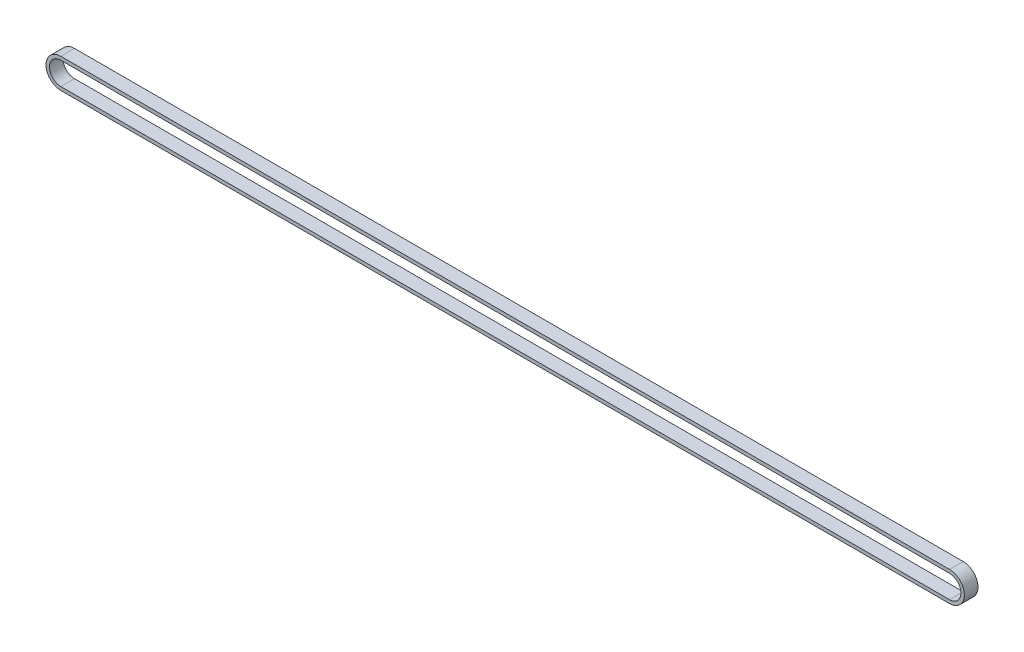
ISO-10303-21;
HEADER;
FILE_DESCRIPTION(('STEP AP214'),'2;1');
FILE_NAME('part.step','',(''),(''),'','','');
FILE_SCHEMA(('AUTOMOTIVE_DESIGN { 1 0 10303 214 1 1 1 1 }'));
ENDSEC;
DATA;
#1=APPLICATION_CONTEXT('core data for automotive mechanical design processes');
#2=APPLICATION_PROTOCOL_DEFINITION('international standard','automotive_design',2000,#1);
#3=PRODUCT_CONTEXT('',#1,'mechanical');
#4=PRODUCT('Part','Part','',(#3));
#5=PRODUCT_RELATED_PRODUCT_CATEGORY('part','',(#4));
#6=PRODUCT_DEFINITION_FORMATION('','',#4);
#7=PRODUCT_DEFINITION_CONTEXT('part definition',#1,'design');
#8=PRODUCT_DEFINITION('design','',#6,#7);
#9=PRODUCT_DEFINITION_SHAPE('','',#8);
#10=(LENGTH_UNIT() NAMED_UNIT(*) SI_UNIT(.MILLI.,.METRE.));
#11=(NAMED_UNIT(*) PLANE_ANGLE_UNIT() SI_UNIT($,.RADIAN.));
#12=(NAMED_UNIT(*) SI_UNIT($,.STERADIAN.) SOLID_ANGLE_UNIT());
#13=UNCERTAINTY_MEASURE_WITH_UNIT(LENGTH_MEASURE(1.E-05),#10,'distance_accuracy_value','');
#14=(GEOMETRIC_REPRESENTATION_CONTEXT(3) GLOBAL_UNCERTAINTY_ASSIGNED_CONTEXT((#13)) GLOBAL_UNIT_ASSIGNED_CONTEXT((#10,
#11,#12)) REPRESENTATION_CONTEXT('',''));
#15=CARTESIAN_POINT('',(0.,0.,0.));
#16=DIRECTION('',(0.,0.,1.));
#17=DIRECTION('',(1.,0.,0.));
#18=AXIS2_PLACEMENT_3D('',#15,#16,#17);
#19=CARTESIAN_POINT('',(0.,0.,6.));
#20=DIRECTION('',(0.,0.,1.));
#21=DIRECTION('',(1.,0.,0.));
#22=AXIS2_PLACEMENT_3D('',#19,#20,#21);
#23=PLANE('',#22);
#24=CARTESIAN_POINT('',(0.,0.,6.));
#25=DIRECTION('',(0.,0.,1.));
#26=DIRECTION('',(1.,0.,0.));
#27=AXIS2_PLACEMENT_3D('',#24,#25,#26);
#28=CIRCLE('',#27,6.5);
#29=CARTESIAN_POINT('',(0.,6.5,6.));
#30=VERTEX_POINT('',#29);
#31=CARTESIAN_POINT('',(0.,-6.5,6.));
#32=VERTEX_POINT('',#31);
#33=EDGE_CURVE('E136',#30,#32,#28,.T.);
#34=ORIENTED_EDGE('',*,*,#33,.T.);
#35=DIRECTION('',(1.,0.,0.));
#36=VECTOR('',#35,1.);
#37=CARTESIAN_POINT('',(0.,-6.5,6.));
#38=LINE('',#37,#36);
#39=CARTESIAN_POINT('',(390.,-6.5,6.));
#40=VERTEX_POINT('',#39);
#41=EDGE_CURVE('E139',#32,#40,#38,.T.);
#42=ORIENTED_EDGE('',*,*,#41,.T.);
#43=CARTESIAN_POINT('',(390.,0.,6.));
#44=DIRECTION('',(0.,0.,1.));
#45=DIRECTION('',(1.,0.,0.));
#46=AXIS2_PLACEMENT_3D('',#43,#44,#45);
#47=CIRCLE('',#46,6.5);
#48=CARTESIAN_POINT('',(390.,6.5,6.));
#49=VERTEX_POINT('',#48);
#50=EDGE_CURVE('E142',#40,#49,#47,.T.);
#51=ORIENTED_EDGE('',*,*,#50,.T.);
#52=DIRECTION('',(-1.,0.,0.));
#53=VECTOR('',#52,1.);
#54=CARTESIAN_POINT('',(0.,6.5,6.));
#55=LINE('',#54,#53);
#56=EDGE_CURVE('E144',#49,#30,#55,.T.);
#57=ORIENTED_EDGE('',*,*,#56,.T.);
#58=EDGE_LOOP('',(#34,#42,#51,#57));
#59=FACE_BOUND('',#58,.T.);
#60=DIRECTION('',(1.,0.,0.));
#61=VECTOR('',#60,1.);
#62=CARTESIAN_POINT('',(0.,-5.,6.));
#63=LINE('',#62,#61);
#64=CARTESIAN_POINT('',(0.,-5.,6.));
#65=VERTEX_POINT('',#64);
#66=CARTESIAN_POINT('',(390.,-5.,6.));
#67=VERTEX_POINT('',#66);
#68=EDGE_CURVE('E108',#65,#67,#63,.T.);
#69=ORIENTED_EDGE('',*,*,#68,.F.);
#70=CARTESIAN_POINT('',(0.,0.,6.));
#71=DIRECTION('',(0.,0.,1.));
#72=DIRECTION('',(1.,0.,0.));
#73=AXIS2_PLACEMENT_3D('',#70,#71,#72);
#74=CIRCLE('',#73,5.);
#75=CARTESIAN_POINT('',(0.,5.,6.));
#76=VERTEX_POINT('',#75);
#77=EDGE_CURVE('E100',#76,#65,#74,.T.);
#78=ORIENTED_EDGE('',*,*,#77,.F.);
#79=DIRECTION('',(-1.,0.,0.));
#80=VECTOR('',#79,1.);
#81=CARTESIAN_POINT('',(0.,5.,6.));
#82=LINE('',#81,#80);
#83=CARTESIAN_POINT('',(390.,5.,6.));
#84=VERTEX_POINT('',#83);
#85=EDGE_CURVE('E122',#84,#76,#82,.T.);
#86=ORIENTED_EDGE('',*,*,#85,.F.);
#87=CARTESIAN_POINT('',(390.,0.,6.));
#88=DIRECTION('',(0.,0.,1.));
#89=DIRECTION('',(1.,0.,0.));
#90=AXIS2_PLACEMENT_3D('',#87,#88,#89);
#91=CIRCLE('',#90,5.);
#92=EDGE_CURVE('E120',#67,#84,#91,.T.);
#93=ORIENTED_EDGE('',*,*,#92,.F.);
#94=EDGE_LOOP('',(#69,#78,#86,#93));
#95=FACE_BOUND('',#94,.T.);
#96=ADVANCED_FACE('F35',(#59,#95),#23,.T.);
#97=CARTESIAN_POINT('',(0.,0.,0.));
#98=DIRECTION('',(0.,0.,1.));
#99=DIRECTION('',(1.,0.,0.));
#100=AXIS2_PLACEMENT_3D('',#97,#98,#99);
#101=PLANE('',#100);
#102=CARTESIAN_POINT('',(0.,0.,0.));
#103=DIRECTION('',(0.,0.,1.));
#104=DIRECTION('',(1.,0.,0.));
#105=AXIS2_PLACEMENT_3D('',#102,#103,#104);
#106=CIRCLE('',#105,6.5);
#107=CARTESIAN_POINT('',(0.,6.5,0.));
#108=VERTEX_POINT('',#107);
#109=CARTESIAN_POINT('',(0.,-6.5,0.));
#110=VERTEX_POINT('',#109);
#111=EDGE_CURVE('E116',#108,#110,#106,.T.);
#112=ORIENTED_EDGE('',*,*,#111,.F.);
#113=DIRECTION('',(-1.,0.,0.));
#114=VECTOR('',#113,1.);
#115=CARTESIAN_POINT('',(0.,6.5,0.));
#116=LINE('',#115,#114);
#117=CARTESIAN_POINT('',(390.,6.5,0.));
#118=VERTEX_POINT('',#117);
#119=EDGE_CURVE('E140',#118,#108,#116,.T.);
#120=ORIENTED_EDGE('',*,*,#119,.F.);
#121=CARTESIAN_POINT('',(390.,0.,0.));
#122=DIRECTION('',(0.,0.,1.));
#123=DIRECTION('',(1.,0.,0.));
#124=AXIS2_PLACEMENT_3D('',#121,#122,#123);
#125=CIRCLE('',#124,6.5);
#126=CARTESIAN_POINT('',(390.,-6.5,0.));
#127=VERTEX_POINT('',#126);
#128=EDGE_CURVE('E151',#127,#118,#125,.T.);
#129=ORIENTED_EDGE('',*,*,#128,.F.);
#130=DIRECTION('',(1.,0.,0.));
#131=VECTOR('',#130,1.);
#132=CARTESIAN_POINT('',(0.,-6.5,0.));
#133=LINE('',#132,#131);
#134=EDGE_CURVE('E149',#110,#127,#133,.T.);
#135=ORIENTED_EDGE('',*,*,#134,.F.);
#136=EDGE_LOOP('',(#112,#120,#129,#135));
#137=FACE_BOUND('',#136,.T.);
#138=CARTESIAN_POINT('',(0.,0.,0.));
#139=DIRECTION('',(0.,0.,1.));
#140=DIRECTION('',(1.,0.,0.));
#141=AXIS2_PLACEMENT_3D('',#138,#139,#140);
#142=CIRCLE('',#141,5.);
#143=CARTESIAN_POINT('',(0.,5.,0.));
#144=VERTEX_POINT('',#143);
#145=CARTESIAN_POINT('',(0.,-5.,0.));
#146=VERTEX_POINT('',#145);
#147=EDGE_CURVE('E58',#144,#146,#142,.T.);
#148=ORIENTED_EDGE('',*,*,#147,.T.);
#149=DIRECTION('',(1.,0.,0.));
#150=VECTOR('',#149,1.);
#151=CARTESIAN_POINT('',(0.,-5.,0.));
#152=LINE('',#151,#150);
#153=CARTESIAN_POINT('',(390.,-5.,0.));
#154=VERTEX_POINT('',#153);
#155=EDGE_CURVE('E115',#146,#154,#152,.T.);
#156=ORIENTED_EDGE('',*,*,#155,.T.);
#157=CARTESIAN_POINT('',(390.,0.,0.));
#158=DIRECTION('',(0.,0.,1.));
#159=DIRECTION('',(1.,0.,0.));
#160=AXIS2_PLACEMENT_3D('',#157,#158,#159);
#161=CIRCLE('',#160,5.);
#162=CARTESIAN_POINT('',(390.,5.,0.));
#163=VERTEX_POINT('',#162);
#164=EDGE_CURVE('E128',#154,#163,#161,.T.);
#165=ORIENTED_EDGE('',*,*,#164,.T.);
#166=DIRECTION('',(-1.,0.,0.));
#167=VECTOR('',#166,1.);
#168=CARTESIAN_POINT('',(0.,5.,0.));
#169=LINE('',#168,#167);
#170=EDGE_CURVE('E109',#163,#144,#169,.T.);
#171=ORIENTED_EDGE('',*,*,#170,.T.);
#172=EDGE_LOOP('',(#148,#156,#165,#171));
#173=FACE_BOUND('',#172,.T.);
#174=ADVANCED_FACE('F169',(#137,#173),#101,.F.);
#175=CARTESIAN_POINT('',(0.,0.,6.));
#176=DIRECTION('',(0.,0.,-1.));
#177=DIRECTION('',(-1.,0.,0.));
#178=AXIS2_PLACEMENT_3D('',#175,#176,#177);
#179=CYLINDRICAL_SURFACE('',#178,6.5);
#180=ORIENTED_EDGE('',*,*,#111,.T.);
#181=DIRECTION('',(0.,0.,-1.));
#182=VECTOR('',#181,1.);
#183=CARTESIAN_POINT('',(0.,-6.5,6.));
#184=LINE('',#183,#182);
#185=EDGE_CURVE('E11',#32,#110,#184,.T.);
#186=ORIENTED_EDGE('',*,*,#185,.F.);
#187=ORIENTED_EDGE('',*,*,#33,.F.);
#188=DIRECTION('',(0.,0.,-1.));
#189=VECTOR('',#188,1.);
#190=CARTESIAN_POINT('',(0.,6.5,6.));
#191=LINE('',#190,#189);
#192=EDGE_CURVE('E146',#30,#108,#191,.T.);
#193=ORIENTED_EDGE('',*,*,#192,.T.);
#194=EDGE_LOOP('',(#180,#186,#187,#193));
#195=FACE_BOUND('',#194,.T.);
#196=ADVANCED_FACE('F37',(#195),#179,.T.);
#197=CARTESIAN_POINT('',(0.,-6.5,6.));
#198=DIRECTION('',(0.,1.,0.));
#199=DIRECTION('',(-1.,0.,0.));
#200=AXIS2_PLACEMENT_3D('',#197,#198,#199);
#201=PLANE('',#200);
#202=ORIENTED_EDGE('',*,*,#134,.T.);
#203=DIRECTION('',(0.,0.,-1.));
#204=VECTOR('',#203,1.);
#205=CARTESIAN_POINT('',(390.,-6.5,6.));
#206=LINE('',#205,#204);
#207=EDGE_CURVE('E43',#40,#127,#206,.T.);
#208=ORIENTED_EDGE('',*,*,#207,.F.);
#209=ORIENTED_EDGE('',*,*,#41,.F.);
#210=ORIENTED_EDGE('',*,*,#185,.T.);
#211=EDGE_LOOP('',(#202,#208,#209,#210));
#212=FACE_BOUND('',#211,.T.);
#213=ADVANCED_FACE('F179',(#212),#201,.F.);
#214=CARTESIAN_POINT('',(390.,0.,6.));
#215=DIRECTION('',(0.,0.,-1.));
#216=DIRECTION('',(-1.,0.,0.));
#217=AXIS2_PLACEMENT_3D('',#214,#215,#216);
#218=CYLINDRICAL_SURFACE('',#217,6.5);
#219=ORIENTED_EDGE('',*,*,#128,.T.);
#220=DIRECTION('',(0.,0.,-1.));
#221=VECTOR('',#220,1.);
#222=CARTESIAN_POINT('',(390.,6.5,6.));
#223=LINE('',#222,#221);
#224=EDGE_CURVE('E156',#49,#118,#223,.T.);
#225=ORIENTED_EDGE('',*,*,#224,.F.);
#226=ORIENTED_EDGE('',*,*,#50,.F.);
#227=ORIENTED_EDGE('',*,*,#207,.T.);
#228=EDGE_LOOP('',(#219,#225,#226,#227));
#229=FACE_BOUND('',#228,.T.);
#230=ADVANCED_FACE('F163',(#229),#218,.T.);
#231=CARTESIAN_POINT('',(0.,6.5,6.));
#232=DIRECTION('',(0.,-1.,0.));
#233=DIRECTION('',(0.,0.,-1.));
#234=AXIS2_PLACEMENT_3D('',#231,#232,#233);
#235=PLANE('',#234);
#236=ORIENTED_EDGE('',*,*,#119,.T.);
#237=ORIENTED_EDGE('',*,*,#192,.F.);
#238=ORIENTED_EDGE('',*,*,#56,.F.);
#239=ORIENTED_EDGE('',*,*,#224,.T.);
#240=EDGE_LOOP('',(#236,#237,#238,#239));
#241=FACE_BOUND('',#240,.T.);
#242=ADVANCED_FACE('F173',(#241),#235,.F.);
#243=CARTESIAN_POINT('',(0.,0.,6.));
#244=DIRECTION('',(0.,0.,-1.));
#245=DIRECTION('',(-1.,0.,0.));
#246=AXIS2_PLACEMENT_3D('',#243,#244,#245);
#247=CYLINDRICAL_SURFACE('',#246,5.);
#248=ORIENTED_EDGE('',*,*,#147,.F.);
#249=DIRECTION('',(0.,0.,-1.));
#250=VECTOR('',#249,1.);
#251=CARTESIAN_POINT('',(0.,5.,6.));
#252=LINE('',#251,#250);
#253=EDGE_CURVE('E104',#76,#144,#252,.T.);
#254=ORIENTED_EDGE('',*,*,#253,.F.);
#255=ORIENTED_EDGE('',*,*,#77,.T.);
#256=DIRECTION('',(0.,0.,-1.));
#257=VECTOR('',#256,1.);
#258=CARTESIAN_POINT('',(0.,-5.,6.));
#259=LINE('',#258,#257);
#260=EDGE_CURVE('E103',#65,#146,#259,.T.);
#261=ORIENTED_EDGE('',*,*,#260,.T.);
#262=EDGE_LOOP('',(#248,#254,#255,#261));
#263=FACE_BOUND('',#262,.T.);
#264=ADVANCED_FACE('F102',(#263),#247,.F.);
#265=CARTESIAN_POINT('',(0.,-5.,6.));
#266=DIRECTION('',(0.,1.,0.));
#267=DIRECTION('',(-1.,0.,0.));
#268=AXIS2_PLACEMENT_3D('',#265,#266,#267);
#269=PLANE('',#268);
#270=ORIENTED_EDGE('',*,*,#155,.F.);
#271=ORIENTED_EDGE('',*,*,#260,.F.);
#272=ORIENTED_EDGE('',*,*,#68,.T.);
#273=DIRECTION('',(0.,0.,-1.));
#274=VECTOR('',#273,1.);
#275=CARTESIAN_POINT('',(390.,-5.,6.));
#276=LINE('',#275,#274);
#277=EDGE_CURVE('E117',#67,#154,#276,.T.);
#278=ORIENTED_EDGE('',*,*,#277,.T.);
#279=EDGE_LOOP('',(#270,#271,#272,#278));
#280=FACE_BOUND('',#279,.T.);
#281=ADVANCED_FACE('F112',(#280),#269,.T.);
#282=CARTESIAN_POINT('',(390.,0.,6.));
#283=DIRECTION('',(0.,0.,-1.));
#284=DIRECTION('',(-1.,0.,0.));
#285=AXIS2_PLACEMENT_3D('',#282,#283,#284);
#286=CYLINDRICAL_SURFACE('',#285,5.);
#287=ORIENTED_EDGE('',*,*,#164,.F.);
#288=ORIENTED_EDGE('',*,*,#277,.F.);
#289=ORIENTED_EDGE('',*,*,#92,.T.);
#290=DIRECTION('',(0.,0.,-1.));
#291=VECTOR('',#290,1.);
#292=CARTESIAN_POINT('',(390.,5.,6.));
#293=LINE('',#292,#291);
#294=EDGE_CURVE('E50',#84,#163,#293,.T.);
#295=ORIENTED_EDGE('',*,*,#294,.T.);
#296=EDGE_LOOP('',(#287,#288,#289,#295));
#297=FACE_BOUND('',#296,.T.);
#298=ADVANCED_FACE('F202',(#297),#286,.F.);
#299=CARTESIAN_POINT('',(0.,5.,6.));
#300=DIRECTION('',(0.,-1.,0.));
#301=DIRECTION('',(1.,0.,0.));
#302=AXIS2_PLACEMENT_3D('',#299,#300,#301);
#303=PLANE('',#302);
#304=ORIENTED_EDGE('',*,*,#170,.F.);
#305=ORIENTED_EDGE('',*,*,#294,.F.);
#306=ORIENTED_EDGE('',*,*,#85,.T.);
#307=ORIENTED_EDGE('',*,*,#253,.T.);
#308=EDGE_LOOP('',(#304,#305,#306,#307));
#309=FACE_BOUND('',#308,.T.);
#310=ADVANCED_FACE('F206',(#309),#303,.T.);
#311=CLOSED_SHELL('',(#96,#174,#196,#213,#230,#242,#264,#281,#298,#310));
#312=MANIFOLD_SOLID_BREP('B2',#311);
#313=ADVANCED_BREP_SHAPE_REPRESENTATION('',(#18,#312),#14);
#314=SHAPE_DEFINITION_REPRESENTATION(#9,#313);
ENDSEC;
END-ISO-10303-21;
